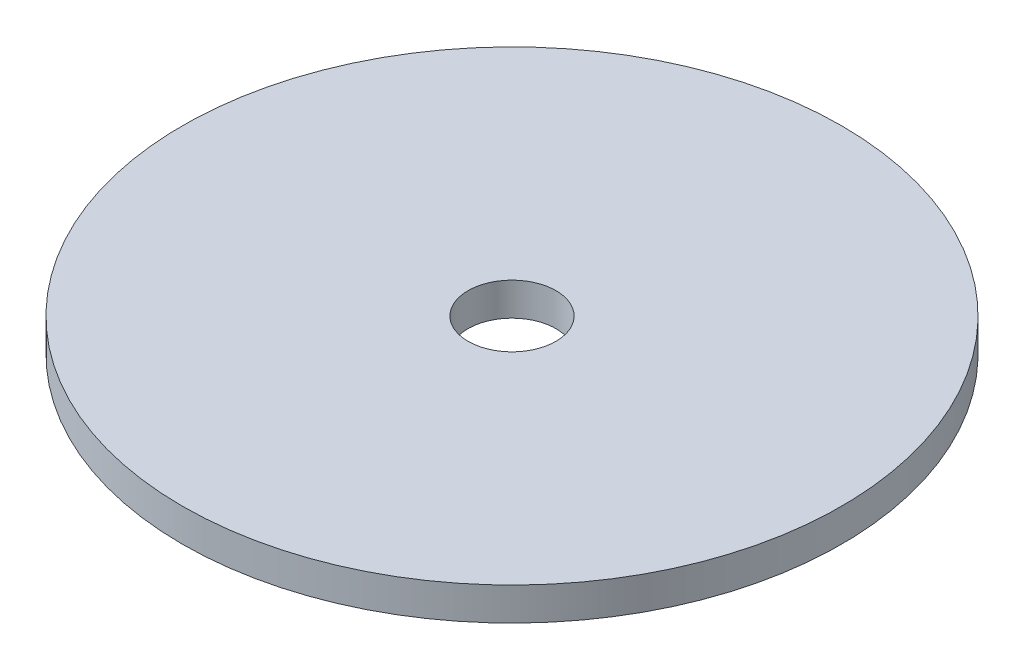
ISO-10303-21;
HEADER;
FILE_DESCRIPTION(('STEP AP214'),'2;1');
FILE_NAME('part.step','',(''),(''),'','','');
FILE_SCHEMA(('AUTOMOTIVE_DESIGN { 1 0 10303 214 1 1 1 1 }'));
ENDSEC;
DATA;
#1=APPLICATION_CONTEXT('core data for automotive mechanical design processes');
#2=APPLICATION_PROTOCOL_DEFINITION('international standard','automotive_design',2000,#1);
#3=PRODUCT_CONTEXT('',#1,'mechanical');
#4=PRODUCT('Part','Part','',(#3));
#5=PRODUCT_RELATED_PRODUCT_CATEGORY('part','',(#4));
#6=PRODUCT_DEFINITION_FORMATION('','',#4);
#7=PRODUCT_DEFINITION_CONTEXT('part definition',#1,'design');
#8=PRODUCT_DEFINITION('design','',#6,#7);
#9=PRODUCT_DEFINITION_SHAPE('','',#8);
#10=(LENGTH_UNIT() NAMED_UNIT(*) SI_UNIT(.MILLI.,.METRE.));
#11=(NAMED_UNIT(*) PLANE_ANGLE_UNIT() SI_UNIT($,.RADIAN.));
#12=(NAMED_UNIT(*) SI_UNIT($,.STERADIAN.) SOLID_ANGLE_UNIT());
#13=UNCERTAINTY_MEASURE_WITH_UNIT(LENGTH_MEASURE(1.E-05),#10,'distance_accuracy_value','');
#14=(GEOMETRIC_REPRESENTATION_CONTEXT(3) GLOBAL_UNCERTAINTY_ASSIGNED_CONTEXT((#13)) GLOBAL_UNIT_ASSIGNED_CONTEXT((#10,
#11,#12)) REPRESENTATION_CONTEXT('',''));
#15=CARTESIAN_POINT('',(0.,0.,0.));
#16=DIRECTION('',(0.,0.,1.));
#17=DIRECTION('',(1.,0.,0.));
#18=AXIS2_PLACEMENT_3D('',#15,#16,#17);
#19=CARTESIAN_POINT('',(0.,3.,0.));
#20=DIRECTION('',(0.,1.,0.));
#21=DIRECTION('',(0.,0.,1.));
#22=AXIS2_PLACEMENT_3D('',#19,#20,#21);
#23=PLANE('',#22);
#24=CARTESIAN_POINT('',(0.,3.,0.));
#25=DIRECTION('',(0.,1.,0.));
#26=DIRECTION('',(0.,0.,1.));
#27=AXIS2_PLACEMENT_3D('',#24,#25,#26);
#28=CIRCLE('',#27,30.);
#29=CARTESIAN_POINT('',(0.,3.,30.));
#30=VERTEX_POINT('',#29);
#31=EDGE_CURVE('E10',#30,#30,#28,.T.);
#32=ORIENTED_EDGE('',*,*,#31,.T.);
#33=EDGE_LOOP('',(#32));
#34=FACE_BOUND('',#33,.T.);
#35=CARTESIAN_POINT('',(0.,3.,0.));
#36=DIRECTION('',(0.,1.,0.));
#37=DIRECTION('',(0.,0.,1.));
#38=AXIS2_PLACEMENT_3D('',#35,#36,#37);
#39=CIRCLE('',#38,4.);
#40=CARTESIAN_POINT('',(0.,3.,4.));
#41=VERTEX_POINT('',#40);
#42=EDGE_CURVE('E45',#41,#41,#39,.T.);
#43=ORIENTED_EDGE('',*,*,#42,.F.);
#44=EDGE_LOOP('',(#43));
#45=FACE_BOUND('',#44,.T.);
#46=ADVANCED_FACE('F34',(#34,#45),#23,.T.);
#47=CARTESIAN_POINT('',(0.,0.,0.));
#48=DIRECTION('',(0.,1.,0.));
#49=DIRECTION('',(0.,0.,1.));
#50=AXIS2_PLACEMENT_3D('',#47,#48,#49);
#51=PLANE('',#50);
#52=CARTESIAN_POINT('',(0.,0.,0.));
#53=DIRECTION('',(0.,1.,0.));
#54=DIRECTION('',(0.,0.,1.));
#55=AXIS2_PLACEMENT_3D('',#52,#53,#54);
#56=CIRCLE('',#55,30.);
#57=CARTESIAN_POINT('',(0.,0.,30.));
#58=VERTEX_POINT('',#57);
#59=EDGE_CURVE('E38',#58,#58,#56,.T.);
#60=ORIENTED_EDGE('',*,*,#59,.F.);
#61=EDGE_LOOP('',(#60));
#62=FACE_BOUND('',#61,.T.);
#63=CARTESIAN_POINT('',(0.,0.,0.));
#64=DIRECTION('',(0.,1.,0.));
#65=DIRECTION('',(0.,0.,1.));
#66=AXIS2_PLACEMENT_3D('',#63,#64,#65);
#67=CIRCLE('',#66,4.);
#68=CARTESIAN_POINT('',(0.,0.,4.));
#69=VERTEX_POINT('',#68);
#70=EDGE_CURVE('E47',#69,#69,#67,.T.);
#71=ORIENTED_EDGE('',*,*,#70,.T.);
#72=EDGE_LOOP('',(#71));
#73=FACE_BOUND('',#72,.T.);
#74=ADVANCED_FACE('F57',(#62,#73),#51,.F.);
#75=CARTESIAN_POINT('',(0.,3.,0.));
#76=DIRECTION('',(0.,-1.,0.));
#77=DIRECTION('',(0.,0.,-1.));
#78=AXIS2_PLACEMENT_3D('',#75,#76,#77);
#79=CYLINDRICAL_SURFACE('',#78,30.);
#80=ORIENTED_EDGE('',*,*,#31,.F.);
#81=EDGE_LOOP('',(#80));
#82=FACE_BOUND('',#81,.T.);
#83=ORIENTED_EDGE('',*,*,#59,.T.);
#84=EDGE_LOOP('',(#83));
#85=FACE_BOUND('',#84,.T.);
#86=ADVANCED_FACE('F36',(#82,#85),#79,.T.);
#87=CARTESIAN_POINT('',(0.,3.,0.));
#88=DIRECTION('',(0.,-1.,0.));
#89=DIRECTION('',(0.,0.,-1.));
#90=AXIS2_PLACEMENT_3D('',#87,#88,#89);
#91=CYLINDRICAL_SURFACE('',#90,4.);
#92=ORIENTED_EDGE('',*,*,#42,.T.);
#93=EDGE_LOOP('',(#92));
#94=FACE_BOUND('',#93,.T.);
#95=ORIENTED_EDGE('',*,*,#70,.F.);
#96=EDGE_LOOP('',(#95));
#97=FACE_BOUND('',#96,.T.);
#98=ADVANCED_FACE('F53',(#94,#97),#91,.F.);
#99=CLOSED_SHELL('',(#46,#74,#86,#98));
#100=MANIFOLD_SOLID_BREP('B2',#99);
#101=ADVANCED_BREP_SHAPE_REPRESENTATION('',(#18,#100),#14);
#102=SHAPE_DEFINITION_REPRESENTATION(#9,#101);
ENDSEC;
END-ISO-10303-21;
